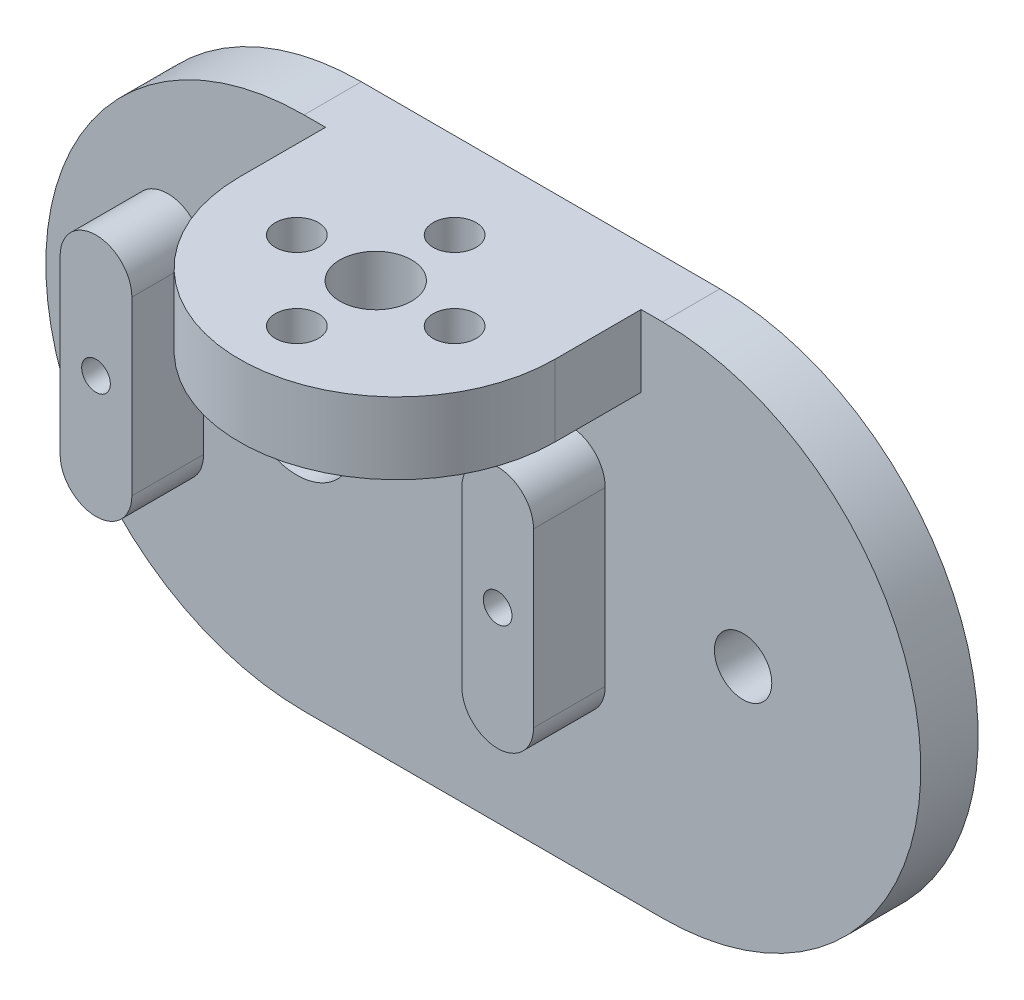
ISO-10303-21;
HEADER;
FILE_DESCRIPTION(('STEP AP214'),'2;1');
FILE_NAME('part.step','',(''),(''),'','','');
FILE_SCHEMA(('AUTOMOTIVE_DESIGN { 1 0 10303 214 1 1 1 1 }'));
ENDSEC;
DATA;
#1=APPLICATION_CONTEXT('core data for automotive mechanical design processes');
#2=APPLICATION_PROTOCOL_DEFINITION('international standard','automotive_design',2000,#1);
#3=PRODUCT_CONTEXT('',#1,'mechanical');
#4=PRODUCT('Part','Part','',(#3));
#5=PRODUCT_RELATED_PRODUCT_CATEGORY('part','',(#4));
#6=PRODUCT_DEFINITION_FORMATION('','',#4);
#7=PRODUCT_DEFINITION_CONTEXT('part definition',#1,'design');
#8=PRODUCT_DEFINITION('design','',#6,#7);
#9=PRODUCT_DEFINITION_SHAPE('','',#8);
#10=(LENGTH_UNIT() NAMED_UNIT(*) SI_UNIT(.MILLI.,.METRE.));
#11=(NAMED_UNIT(*) PLANE_ANGLE_UNIT() SI_UNIT($,.RADIAN.));
#12=(NAMED_UNIT(*) SI_UNIT($,.STERADIAN.) SOLID_ANGLE_UNIT());
#13=UNCERTAINTY_MEASURE_WITH_UNIT(LENGTH_MEASURE(1.E-05),#10,'distance_accuracy_value','');
#14=(GEOMETRIC_REPRESENTATION_CONTEXT(3) GLOBAL_UNCERTAINTY_ASSIGNED_CONTEXT((#13)) GLOBAL_UNIT_ASSIGNED_CONTEXT((#10,
#11,#12)) REPRESENTATION_CONTEXT('',''));
#15=CARTESIAN_POINT('',(0.,0.,0.));
#16=DIRECTION('',(0.,0.,1.));
#17=DIRECTION('',(1.,0.,0.));
#18=AXIS2_PLACEMENT_3D('',#15,#16,#17);
#19=CARTESIAN_POINT('',(0.,13.,10.));
#20=DIRECTION('',(0.,-1.,0.));
#21=DIRECTION('',(1.,0.,0.));
#22=AXIS2_PLACEMENT_3D('',#19,#20,#21);
#23=CYLINDRICAL_SURFACE('',#22,11.);
#24=DIRECTION('',(0.,-1.,0.));
#25=VECTOR('',#24,1.);
#26=CARTESIAN_POINT('',(-11.,18.,10.));
#27=LINE('',#26,#25);
#28=CARTESIAN_POINT('',(-11.,13.,10.));
#29=VERTEX_POINT('',#28);
#30=CARTESIAN_POINT('',(-11.,18.,10.));
#31=VERTEX_POINT('',#30);
#32=EDGE_CURVE('E217',#29,#31,#27,.F.);
#33=ORIENTED_EDGE('',*,*,#32,.F.);
#34=CARTESIAN_POINT('',(0.,13.,10.));
#35=DIRECTION('',(0.,1.,0.));
#36=DIRECTION('',(-1.,0.,0.));
#37=AXIS2_PLACEMENT_3D('',#34,#35,#36);
#38=CIRCLE('',#37,11.);
#39=CARTESIAN_POINT('',(11.,13.,10.));
#40=VERTEX_POINT('',#39);
#41=EDGE_CURVE('E52',#40,#29,#38,.F.);
#42=ORIENTED_EDGE('',*,*,#41,.F.);
#43=DIRECTION('',(0.,-1.,0.));
#44=VECTOR('',#43,1.);
#45=CARTESIAN_POINT('',(11.,18.,10.));
#46=LINE('',#45,#44);
#47=CARTESIAN_POINT('',(11.,18.,10.));
#48=VERTEX_POINT('',#47);
#49=EDGE_CURVE('E239',#48,#40,#46,.T.);
#50=ORIENTED_EDGE('',*,*,#49,.F.);
#51=CARTESIAN_POINT('',(0.,18.,10.));
#52=DIRECTION('',(0.,-1.,0.));
#53=DIRECTION('',(0.,0.,-1.));
#54=AXIS2_PLACEMENT_3D('',#51,#52,#53);
#55=CIRCLE('',#54,11.);
#56=EDGE_CURVE('E11',#31,#48,#55,.F.);
#57=ORIENTED_EDGE('',*,*,#56,.F.);
#58=EDGE_LOOP('',(#33,#42,#50,#57));
#59=FACE_BOUND('',#58,.T.);
#60=ADVANCED_FACE('F43',(#59),#23,.T.);
#61=CARTESIAN_POINT('',(-12.5,0.,4.));
#62=DIRECTION('',(0.,0.,1.));
#63=DIRECTION('',(1.,0.,0.));
#64=AXIS2_PLACEMENT_3D('',#61,#62,#63);
#65=PLANE('',#64);
#66=CARTESIAN_POINT('',(18.1101964169557,0.,4.));
#67=DIRECTION('',(0.,0.,1.));
#68=DIRECTION('',(1.,0.,0.));
#69=AXIS2_PLACEMENT_3D('',#66,#67,#68);
#70=CIRCLE('',#69,2.);
#71=CARTESIAN_POINT('',(20.1101964169557,0.,4.));
#72=VERTEX_POINT('',#71);
#73=EDGE_CURVE('E161',#72,#72,#70,.T.);
#74=ORIENTED_EDGE('',*,*,#73,.F.);
#75=EDGE_LOOP('',(#74));
#76=FACE_BOUND('',#75,.T.);
#77=CARTESIAN_POINT('',(-13.,0.,4.));
#78=DIRECTION('',(0.,0.,1.));
#79=DIRECTION('',(1.,0.,0.));
#80=AXIS2_PLACEMENT_3D('',#77,#78,#79);
#81=CIRCLE('',#80,4.);
#82=CARTESIAN_POINT('',(-9.,0.,4.));
#83=VERTEX_POINT('',#82);
#84=EDGE_CURVE('E223',#83,#83,#81,.T.);
#85=ORIENTED_EDGE('',*,*,#84,.F.);
#86=EDGE_LOOP('',(#85));
#87=FACE_BOUND('',#86,.T.);
#88=CARTESIAN_POINT('',(6.,-6.,4.));
#89=DIRECTION('',(0.,0.,1.));
#90=DIRECTION('',(1.,0.,0.));
#91=AXIS2_PLACEMENT_3D('',#88,#89,#90);
#92=CIRCLE('',#91,2.5);
#93=CARTESIAN_POINT('',(3.5,-6.,4.));
#94=VERTEX_POINT('',#93);
#95=CARTESIAN_POINT('',(8.5,-6.,4.));
#96=VERTEX_POINT('',#95);
#97=EDGE_CURVE('E288',#94,#96,#92,.T.);
#98=ORIENTED_EDGE('',*,*,#97,.F.);
#99=DIRECTION('',(0.,-1.,0.));
#100=VECTOR('',#99,1.);
#101=CARTESIAN_POINT('',(3.5,0.,4.));
#102=LINE('',#101,#100);
#103=CARTESIAN_POINT('',(3.5,6.,4.));
#104=VERTEX_POINT('',#103);
#105=EDGE_CURVE('E235',#104,#94,#102,.T.);
#106=ORIENTED_EDGE('',*,*,#105,.F.);
#107=CARTESIAN_POINT('',(6.,6.,4.));
#108=DIRECTION('',(0.,0.,1.));
#109=DIRECTION('',(1.,0.,0.));
#110=AXIS2_PLACEMENT_3D('',#107,#108,#109);
#111=CIRCLE('',#110,2.5);
#112=CARTESIAN_POINT('',(8.5,6.,4.));
#113=VERTEX_POINT('',#112);
#114=EDGE_CURVE('E270',#113,#104,#111,.T.);
#115=ORIENTED_EDGE('',*,*,#114,.F.);
#116=DIRECTION('',(0.,-1.,0.));
#117=VECTOR('',#116,1.);
#118=CARTESIAN_POINT('',(8.5,0.,4.));
#119=LINE('',#118,#117);
#120=EDGE_CURVE('E292',#113,#96,#119,.T.);
#121=ORIENTED_EDGE('',*,*,#120,.T.);
#122=EDGE_LOOP('',(#98,#106,#115,#121));
#123=FACE_BOUND('',#122,.T.);
#124=CARTESIAN_POINT('',(-22.,-6.,4.));
#125=DIRECTION('',(0.,0.,1.));
#126=DIRECTION('',(1.,0.,0.));
#127=AXIS2_PLACEMENT_3D('',#124,#125,#126);
#128=CIRCLE('',#127,2.5);
#129=CARTESIAN_POINT('',(-24.5,-6.00000000000002,4.));
#130=VERTEX_POINT('',#129);
#131=CARTESIAN_POINT('',(-19.5,-6.00000000000002,4.));
#132=VERTEX_POINT('',#131);
#133=EDGE_CURVE('E335',#130,#132,#128,.T.);
#134=ORIENTED_EDGE('',*,*,#133,.F.);
#135=DIRECTION('',(0.,-1.,0.));
#136=VECTOR('',#135,1.);
#137=CARTESIAN_POINT('',(-24.5,0.,4.));
#138=LINE('',#137,#136);
#139=CARTESIAN_POINT('',(-24.5,5.99999999999998,4.));
#140=VERTEX_POINT('',#139);
#141=EDGE_CURVE('E311',#140,#130,#138,.T.);
#142=ORIENTED_EDGE('',*,*,#141,.F.);
#143=CARTESIAN_POINT('',(-22.,5.99999999999998,4.));
#144=DIRECTION('',(0.,0.,1.));
#145=DIRECTION('',(1.,0.,0.));
#146=AXIS2_PLACEMENT_3D('',#143,#144,#145);
#147=CIRCLE('',#146,2.5);
#148=CARTESIAN_POINT('',(-19.5,5.99999999999998,4.));
#149=VERTEX_POINT('',#148);
#150=EDGE_CURVE('E317',#149,#140,#147,.T.);
#151=ORIENTED_EDGE('',*,*,#150,.F.);
#152=DIRECTION('',(0.,-1.,0.));
#153=VECTOR('',#152,1.);
#154=CARTESIAN_POINT('',(-19.5,0.,4.));
#155=LINE('',#154,#153);
#156=EDGE_CURVE('E339',#149,#132,#155,.T.);
#157=ORIENTED_EDGE('',*,*,#156,.T.);
#158=EDGE_LOOP('',(#134,#142,#151,#157));
#159=FACE_BOUND('',#158,.T.);
#160=DIRECTION('',(-1.,0.,0.));
#161=VECTOR('',#160,1.);
#162=CARTESIAN_POINT('',(-12.5,18.,4.));
#163=LINE('',#162,#161);
#164=CARTESIAN_POINT('',(12.5,18.,4.));
#165=VERTEX_POINT('',#164);
#166=CARTESIAN_POINT('',(11.,18.,4.));
#167=VERTEX_POINT('',#166);
#168=EDGE_CURVE('E158',#165,#167,#163,.T.);
#169=ORIENTED_EDGE('',*,*,#168,.T.);
#170=DIRECTION('',(0.,1.,0.));
#171=VECTOR('',#170,1.);
#172=CARTESIAN_POINT('',(11.,18.,4.));
#173=LINE('',#172,#171);
#174=CARTESIAN_POINT('',(11.,13.,4.));
#175=VERTEX_POINT('',#174);
#176=EDGE_CURVE('E165',#175,#167,#173,.T.);
#177=ORIENTED_EDGE('',*,*,#176,.F.);
#178=DIRECTION('',(1.,0.,0.));
#179=VECTOR('',#178,1.);
#180=CARTESIAN_POINT('',(11.,13.,4.));
#181=LINE('',#180,#179);
#182=CARTESIAN_POINT('',(-11.,13.,4.));
#183=VERTEX_POINT('',#182);
#184=EDGE_CURVE('E255',#183,#175,#181,.T.);
#185=ORIENTED_EDGE('',*,*,#184,.F.);
#186=DIRECTION('',(0.,-1.,0.));
#187=VECTOR('',#186,1.);
#188=CARTESIAN_POINT('',(-11.,18.,4.));
#189=LINE('',#188,#187);
#190=CARTESIAN_POINT('',(-11.,18.,4.));
#191=VERTEX_POINT('',#190);
#192=EDGE_CURVE('E173',#191,#183,#189,.T.);
#193=ORIENTED_EDGE('',*,*,#192,.F.);
#194=CARTESIAN_POINT('',(-12.5,18.,4.));
#195=VERTEX_POINT('',#194);
#196=EDGE_CURVE('E182',#191,#195,#163,.T.);
#197=ORIENTED_EDGE('',*,*,#196,.T.);
#198=CARTESIAN_POINT('',(-12.5,0.,4.));
#199=DIRECTION('',(0.,0.,1.));
#200=DIRECTION('',(1.,0.,0.));
#201=AXIS2_PLACEMENT_3D('',#198,#199,#200);
#202=CIRCLE('',#201,18.);
#203=CARTESIAN_POINT('',(-12.5,-18.,4.));
#204=VERTEX_POINT('',#203);
#205=EDGE_CURVE('E205',#195,#204,#202,.T.);
#206=ORIENTED_EDGE('',*,*,#205,.T.);
#207=DIRECTION('',(1.,0.,0.));
#208=VECTOR('',#207,1.);
#209=CARTESIAN_POINT('',(-12.5,-18.,4.));
#210=LINE('',#209,#208);
#211=CARTESIAN_POINT('',(12.5,-18.,4.));
#212=VERTEX_POINT('',#211);
#213=EDGE_CURVE('E359',#204,#212,#210,.T.);
#214=ORIENTED_EDGE('',*,*,#213,.T.);
#215=CARTESIAN_POINT('',(12.5,0.,4.));
#216=DIRECTION('',(0.,0.,1.));
#217=DIRECTION('',(1.,0.,0.));
#218=AXIS2_PLACEMENT_3D('',#215,#216,#217);
#219=CIRCLE('',#218,18.);
#220=EDGE_CURVE('E178',#212,#165,#219,.T.);
#221=ORIENTED_EDGE('',*,*,#220,.T.);
#222=EDGE_LOOP('',(#169,#177,#185,#193,#197,#206,#214,#221));
#223=FACE_BOUND('',#222,.T.);
#224=ADVANCED_FACE('F176',(#76,#87,#123,#159,#223),#65,.T.);
#225=CARTESIAN_POINT('',(-12.5,0.,4.));
#226=DIRECTION('',(0.,0.,-1.));
#227=DIRECTION('',(-1.,0.,0.));
#228=AXIS2_PLACEMENT_3D('',#225,#226,#227);
#229=CYLINDRICAL_SURFACE('',#228,18.);
#230=CARTESIAN_POINT('',(-12.5,0.,0.));
#231=DIRECTION('',(0.,0.,1.));
#232=DIRECTION('',(1.,0.,0.));
#233=AXIS2_PLACEMENT_3D('',#230,#231,#232);
#234=CIRCLE('',#233,18.);
#235=CARTESIAN_POINT('',(-12.5,18.,0.));
#236=VERTEX_POINT('',#235);
#237=CARTESIAN_POINT('',(-12.5,-18.,0.));
#238=VERTEX_POINT('',#237);
#239=EDGE_CURVE('E192',#236,#238,#234,.T.);
#240=ORIENTED_EDGE('',*,*,#239,.T.);
#241=DIRECTION('',(0.,0.,-1.));
#242=VECTOR('',#241,1.);
#243=CARTESIAN_POINT('',(-12.5,-18.,4.));
#244=LINE('',#243,#242);
#245=EDGE_CURVE('E213',#204,#238,#244,.T.);
#246=ORIENTED_EDGE('',*,*,#245,.F.);
#247=ORIENTED_EDGE('',*,*,#205,.F.);
#248=DIRECTION('',(0.,0.,-1.));
#249=VECTOR('',#248,1.);
#250=CARTESIAN_POINT('',(-12.5,18.,4.));
#251=LINE('',#250,#249);
#252=EDGE_CURVE('E181',#195,#236,#251,.T.);
#253=ORIENTED_EDGE('',*,*,#252,.T.);
#254=EDGE_LOOP('',(#240,#246,#247,#253));
#255=FACE_BOUND('',#254,.T.);
#256=ADVANCED_FACE('F376',(#255),#229,.T.);
#257=CARTESIAN_POINT('',(-12.5,-18.,4.));
#258=DIRECTION('',(0.,1.,0.));
#259=DIRECTION('',(-1.,0.,0.));
#260=AXIS2_PLACEMENT_3D('',#257,#258,#259);
#261=PLANE('',#260);
#262=DIRECTION('',(1.,0.,0.));
#263=VECTOR('',#262,1.);
#264=CARTESIAN_POINT('',(-12.5,-18.,0.));
#265=LINE('',#264,#263);
#266=CARTESIAN_POINT('',(12.5,-18.,0.));
#267=VERTEX_POINT('',#266);
#268=EDGE_CURVE('E196',#238,#267,#265,.T.);
#269=ORIENTED_EDGE('',*,*,#268,.T.);
#270=DIRECTION('',(0.,0.,-1.));
#271=VECTOR('',#270,1.);
#272=CARTESIAN_POINT('',(12.5,-18.,4.));
#273=LINE('',#272,#271);
#274=EDGE_CURVE('E209',#212,#267,#273,.T.);
#275=ORIENTED_EDGE('',*,*,#274,.F.);
#276=ORIENTED_EDGE('',*,*,#213,.F.);
#277=ORIENTED_EDGE('',*,*,#245,.T.);
#278=EDGE_LOOP('',(#269,#275,#276,#277));
#279=FACE_BOUND('',#278,.T.);
#280=ADVANCED_FACE('F366',(#279),#261,.F.);
#281=CARTESIAN_POINT('',(12.5,0.,4.));
#282=DIRECTION('',(0.,0.,-1.));
#283=DIRECTION('',(-1.,0.,0.));
#284=AXIS2_PLACEMENT_3D('',#281,#282,#283);
#285=CYLINDRICAL_SURFACE('',#284,18.);
#286=CARTESIAN_POINT('',(12.5,0.,0.));
#287=DIRECTION('',(0.,0.,1.));
#288=DIRECTION('',(1.,0.,0.));
#289=AXIS2_PLACEMENT_3D('',#286,#287,#288);
#290=CIRCLE('',#289,18.);
#291=CARTESIAN_POINT('',(12.5,18.,0.));
#292=VERTEX_POINT('',#291);
#293=EDGE_CURVE('E200',#267,#292,#290,.T.);
#294=ORIENTED_EDGE('',*,*,#293,.T.);
#295=DIRECTION('',(0.,0.,-1.));
#296=VECTOR('',#295,1.);
#297=CARTESIAN_POINT('',(12.5,18.,4.));
#298=LINE('',#297,#296);
#299=EDGE_CURVE('E187',#165,#292,#298,.T.);
#300=ORIENTED_EDGE('',*,*,#299,.F.);
#301=ORIENTED_EDGE('',*,*,#220,.F.);
#302=ORIENTED_EDGE('',*,*,#274,.T.);
#303=EDGE_LOOP('',(#294,#300,#301,#302));
#304=FACE_BOUND('',#303,.T.);
#305=ADVANCED_FACE('F369',(#304),#285,.T.);
#306=CARTESIAN_POINT('',(-12.5,18.,4.));
#307=DIRECTION('',(0.,-1.,0.));
#308=DIRECTION('',(0.,0.,-1.));
#309=AXIS2_PLACEMENT_3D('',#306,#307,#308);
#310=PLANE('',#309);
#311=CARTESIAN_POINT('',(5.5,18.,11.5));
#312=DIRECTION('',(0.,-1.,0.));
#313=DIRECTION('',(0.,0.,-1.));
#314=AXIS2_PLACEMENT_3D('',#311,#312,#313);
#315=CIRCLE('',#314,1.5);
#316=CARTESIAN_POINT('',(5.5,18.,10.));
#317=VERTEX_POINT('',#316);
#318=EDGE_CURVE('E174',#317,#317,#315,.T.);
#319=ORIENTED_EDGE('',*,*,#318,.T.);
#320=EDGE_LOOP('',(#319));
#321=FACE_BOUND('',#320,.T.);
#322=CARTESIAN_POINT('',(0.,18.,6.));
#323=DIRECTION('',(0.,-1.,0.));
#324=DIRECTION('',(0.,0.,-1.));
#325=AXIS2_PLACEMENT_3D('',#322,#323,#324);
#326=CIRCLE('',#325,1.5);
#327=CARTESIAN_POINT('',(0.,18.,4.5));
#328=VERTEX_POINT('',#327);
#329=EDGE_CURVE('E385',#328,#328,#326,.T.);
#330=ORIENTED_EDGE('',*,*,#329,.T.);
#331=EDGE_LOOP('',(#330));
#332=FACE_BOUND('',#331,.T.);
#333=CARTESIAN_POINT('',(-5.5,18.,11.5));
#334=DIRECTION('',(0.,-1.,0.));
#335=DIRECTION('',(0.,0.,-1.));
#336=AXIS2_PLACEMENT_3D('',#333,#334,#335);
#337=CIRCLE('',#336,1.5);
#338=CARTESIAN_POINT('',(-5.5,18.,10.));
#339=VERTEX_POINT('',#338);
#340=EDGE_CURVE('E389',#339,#339,#337,.T.);
#341=ORIENTED_EDGE('',*,*,#340,.T.);
#342=EDGE_LOOP('',(#341));
#343=FACE_BOUND('',#342,.T.);
#344=CARTESIAN_POINT('',(0.,18.,11.5));
#345=DIRECTION('',(0.,-1.,0.));
#346=DIRECTION('',(0.,0.,-1.));
#347=AXIS2_PLACEMENT_3D('',#344,#345,#346);
#348=CIRCLE('',#347,2.5);
#349=CARTESIAN_POINT('',(0.,18.,9.));
#350=VERTEX_POINT('',#349);
#351=EDGE_CURVE('E393',#350,#350,#348,.T.);
#352=ORIENTED_EDGE('',*,*,#351,.T.);
#353=EDGE_LOOP('',(#352));
#354=FACE_BOUND('',#353,.T.);
#355=CARTESIAN_POINT('',(0.,18.,17.));
#356=DIRECTION('',(0.,-1.,0.));
#357=DIRECTION('',(0.,0.,-1.));
#358=AXIS2_PLACEMENT_3D('',#355,#356,#357);
#359=CIRCLE('',#358,1.5);
#360=CARTESIAN_POINT('',(0.,18.,15.5));
#361=VERTEX_POINT('',#360);
#362=EDGE_CURVE('E397',#361,#361,#359,.T.);
#363=ORIENTED_EDGE('',*,*,#362,.T.);
#364=EDGE_LOOP('',(#363));
#365=FACE_BOUND('',#364,.T.);
#366=DIRECTION('',(0.,0.,-1.));
#367=VECTOR('',#366,1.);
#368=CARTESIAN_POINT('',(-11.,18.,21.));
#369=LINE('',#368,#367);
#370=EDGE_CURVE('E162',#31,#191,#369,.T.);
#371=ORIENTED_EDGE('',*,*,#370,.F.);
#372=ORIENTED_EDGE('',*,*,#56,.T.);
#373=DIRECTION('',(0.,0.,-1.));
#374=VECTOR('',#373,1.);
#375=CARTESIAN_POINT('',(11.,18.,21.));
#376=LINE('',#375,#374);
#377=EDGE_CURVE('E153',#48,#167,#376,.T.);
#378=ORIENTED_EDGE('',*,*,#377,.T.);
#379=ORIENTED_EDGE('',*,*,#168,.F.);
#380=ORIENTED_EDGE('',*,*,#299,.T.);
#381=DIRECTION('',(-1.,0.,0.));
#382=VECTOR('',#381,1.);
#383=CARTESIAN_POINT('',(-12.5,18.,0.));
#384=LINE('',#383,#382);
#385=EDGE_CURVE('E203',#292,#236,#384,.T.);
#386=ORIENTED_EDGE('',*,*,#385,.T.);
#387=ORIENTED_EDGE('',*,*,#252,.F.);
#388=ORIENTED_EDGE('',*,*,#196,.F.);
#389=EDGE_LOOP('',(#371,#372,#378,#379,#380,#386,#387,#388));
#390=FACE_BOUND('',#389,.T.);
#391=ADVANCED_FACE('F155',(#321,#332,#343,#354,#365,#390),#310,.F.);
#392=CARTESIAN_POINT('',(-12.5,0.,0.));
#393=DIRECTION('',(0.,0.,1.));
#394=DIRECTION('',(1.,0.,0.));
#395=AXIS2_PLACEMENT_3D('',#392,#393,#394);
#396=PLANE('',#395);
#397=CARTESIAN_POINT('',(18.1101964169557,0.,0.));
#398=DIRECTION('',(0.,0.,1.));
#399=DIRECTION('',(1.,0.,0.));
#400=AXIS2_PLACEMENT_3D('',#397,#398,#399);
#401=CIRCLE('',#400,2.);
#402=CARTESIAN_POINT('',(20.1101964169557,0.,0.));
#403=VERTEX_POINT('',#402);
#404=EDGE_CURVE('E231',#403,#403,#401,.T.);
#405=ORIENTED_EDGE('',*,*,#404,.T.);
#406=EDGE_LOOP('',(#405));
#407=FACE_BOUND('',#406,.T.);
#408=CARTESIAN_POINT('',(-22.,0.,0.));
#409=DIRECTION('',(0.,0.,1.));
#410=DIRECTION('',(1.,0.,0.));
#411=AXIS2_PLACEMENT_3D('',#408,#409,#410);
#412=CIRCLE('',#411,1.);
#413=CARTESIAN_POINT('',(-21.,0.,0.));
#414=VERTEX_POINT('',#413);
#415=EDGE_CURVE('E227',#414,#414,#412,.T.);
#416=ORIENTED_EDGE('',*,*,#415,.T.);
#417=EDGE_LOOP('',(#416));
#418=FACE_BOUND('',#417,.T.);
#419=CARTESIAN_POINT('',(6.,0.,0.));
#420=DIRECTION('',(0.,0.,1.));
#421=DIRECTION('',(1.,0.,0.));
#422=AXIS2_PLACEMENT_3D('',#419,#420,#421);
#423=CIRCLE('',#422,1.);
#424=CARTESIAN_POINT('',(7.,0.,0.));
#425=VERTEX_POINT('',#424);
#426=EDGE_CURVE('E222',#425,#425,#423,.T.);
#427=ORIENTED_EDGE('',*,*,#426,.T.);
#428=EDGE_LOOP('',(#427));
#429=FACE_BOUND('',#428,.T.);
#430=CARTESIAN_POINT('',(-13.,0.,0.));
#431=DIRECTION('',(0.,0.,1.));
#432=DIRECTION('',(1.,0.,0.));
#433=AXIS2_PLACEMENT_3D('',#430,#431,#432);
#434=CIRCLE('',#433,4.);
#435=CARTESIAN_POINT('',(-9.,0.,0.));
#436=VERTEX_POINT('',#435);
#437=EDGE_CURVE('E218',#436,#436,#434,.T.);
#438=ORIENTED_EDGE('',*,*,#437,.T.);
#439=EDGE_LOOP('',(#438));
#440=FACE_BOUND('',#439,.T.);
#441=ORIENTED_EDGE('',*,*,#239,.F.);
#442=ORIENTED_EDGE('',*,*,#385,.F.);
#443=ORIENTED_EDGE('',*,*,#293,.F.);
#444=ORIENTED_EDGE('',*,*,#268,.F.);
#445=EDGE_LOOP('',(#441,#442,#443,#444));
#446=FACE_BOUND('',#445,.T.);
#447=ADVANCED_FACE('F374',(#407,#418,#429,#440,#446),#396,.F.);
#448=CARTESIAN_POINT('',(-24.5,0.,9.));
#449=DIRECTION('',(1.,0.,0.));
#450=DIRECTION('',(0.,1.,0.));
#451=AXIS2_PLACEMENT_3D('',#448,#449,#450);
#452=PLANE('',#451);
#453=ORIENTED_EDGE('',*,*,#141,.T.);
#454=DIRECTION('',(0.,0.,-1.));
#455=VECTOR('',#454,1.);
#456=CARTESIAN_POINT('',(-24.5,-6.00000000000002,9.));
#457=LINE('',#456,#455);
#458=CARTESIAN_POINT('',(-24.5,-6.00000000000002,9.));
#459=VERTEX_POINT('',#458);
#460=EDGE_CURVE('E197',#459,#130,#457,.T.);
#461=ORIENTED_EDGE('',*,*,#460,.F.);
#462=DIRECTION('',(0.,-1.,0.));
#463=VECTOR('',#462,1.);
#464=CARTESIAN_POINT('',(-24.5,0.,9.));
#465=LINE('',#464,#463);
#466=CARTESIAN_POINT('',(-24.5,5.99999999999998,9.));
#467=VERTEX_POINT('',#466);
#468=EDGE_CURVE('E316',#467,#459,#465,.T.);
#469=ORIENTED_EDGE('',*,*,#468,.F.);
#470=DIRECTION('',(0.,0.,-1.));
#471=VECTOR('',#470,1.);
#472=CARTESIAN_POINT('',(-24.5,5.99999999999998,9.));
#473=LINE('',#472,#471);
#474=EDGE_CURVE('E331',#467,#140,#473,.T.);
#475=ORIENTED_EDGE('',*,*,#474,.T.);
#476=EDGE_LOOP('',(#453,#461,#469,#475));
#477=FACE_BOUND('',#476,.T.);
#478=ADVANCED_FACE('F450',(#477),#452,.F.);
#479=CARTESIAN_POINT('',(-22.,-6.,9.));
#480=DIRECTION('',(0.,0.,-1.));
#481=DIRECTION('',(-1.,0.,0.));
#482=AXIS2_PLACEMENT_3D('',#479,#480,#481);
#483=CYLINDRICAL_SURFACE('',#482,2.5);
#484=ORIENTED_EDGE('',*,*,#133,.T.);
#485=DIRECTION('',(0.,0.,-1.));
#486=VECTOR('',#485,1.);
#487=CARTESIAN_POINT('',(-19.5,-6.00000000000002,9.));
#488=LINE('',#487,#486);
#489=CARTESIAN_POINT('',(-19.5,-6.00000000000002,9.));
#490=VERTEX_POINT('',#489);
#491=EDGE_CURVE('E352',#490,#132,#488,.T.);
#492=ORIENTED_EDGE('',*,*,#491,.F.);
#493=CARTESIAN_POINT('',(-22.,-6.,9.));
#494=DIRECTION('',(0.,0.,1.));
#495=DIRECTION('',(1.,0.,0.));
#496=AXIS2_PLACEMENT_3D('',#493,#494,#495);
#497=CIRCLE('',#496,2.5);
#498=EDGE_CURVE('E321',#459,#490,#497,.T.);
#499=ORIENTED_EDGE('',*,*,#498,.F.);
#500=ORIENTED_EDGE('',*,*,#460,.T.);
#501=EDGE_LOOP('',(#484,#492,#499,#500));
#502=FACE_BOUND('',#501,.T.);
#503=ADVANCED_FACE('F475',(#502),#483,.T.);
#504=CARTESIAN_POINT('',(-19.5,0.,9.));
#505=DIRECTION('',(1.,0.,0.));
#506=DIRECTION('',(0.,0.,-1.));
#507=AXIS2_PLACEMENT_3D('',#504,#505,#506);
#508=PLANE('',#507);
#509=ORIENTED_EDGE('',*,*,#156,.F.);
#510=DIRECTION('',(0.,0.,-1.));
#511=VECTOR('',#510,1.);
#512=CARTESIAN_POINT('',(-19.5,5.99999999999999,9.));
#513=LINE('',#512,#511);
#514=CARTESIAN_POINT('',(-19.5,5.99999999999999,9.));
#515=VERTEX_POINT('',#514);
#516=EDGE_CURVE('E348',#515,#149,#513,.T.);
#517=ORIENTED_EDGE('',*,*,#516,.F.);
#518=DIRECTION('',(0.,-1.,0.));
#519=VECTOR('',#518,1.);
#520=CARTESIAN_POINT('',(-19.5,0.,9.));
#521=LINE('',#520,#519);
#522=EDGE_CURVE('E324',#515,#490,#521,.T.);
#523=ORIENTED_EDGE('',*,*,#522,.T.);
#524=ORIENTED_EDGE('',*,*,#491,.T.);
#525=EDGE_LOOP('',(#509,#517,#523,#524));
#526=FACE_BOUND('',#525,.T.);
#527=ADVANCED_FACE('F471',(#526),#508,.T.);
#528=CARTESIAN_POINT('',(-22.,0.,9.));
#529=DIRECTION('',(0.,0.,-1.));
#530=DIRECTION('',(-1.,0.,0.));
#531=AXIS2_PLACEMENT_3D('',#528,#529,#530);
#532=CYLINDRICAL_SURFACE('',#531,1.);
#533=CARTESIAN_POINT('',(-22.,0.,9.));
#534=DIRECTION('',(0.,0.,1.));
#535=DIRECTION('',(1.,0.,0.));
#536=AXIS2_PLACEMENT_3D('',#533,#534,#535);
#537=CIRCLE('',#536,1.);
#538=CARTESIAN_POINT('',(-21.,0.,9.));
#539=VERTEX_POINT('',#538);
#540=EDGE_CURVE('E312',#539,#539,#537,.T.);
#541=ORIENTED_EDGE('',*,*,#540,.T.);
#542=EDGE_LOOP('',(#541));
#543=FACE_BOUND('',#542,.T.);
#544=ORIENTED_EDGE('',*,*,#415,.F.);
#545=EDGE_LOOP('',(#544));
#546=FACE_BOUND('',#545,.T.);
#547=ADVANCED_FACE('F467',(#543,#546),#532,.F.);
#548=CARTESIAN_POINT('',(-22.,5.99999999999998,9.));
#549=DIRECTION('',(0.,0.,-1.));
#550=DIRECTION('',(-1.,0.,0.));
#551=AXIS2_PLACEMENT_3D('',#548,#549,#550);
#552=CYLINDRICAL_SURFACE('',#551,2.5);
#553=ORIENTED_EDGE('',*,*,#150,.T.);
#554=ORIENTED_EDGE('',*,*,#474,.F.);
#555=CARTESIAN_POINT('',(-22.,5.99999999999998,9.));
#556=DIRECTION('',(0.,0.,1.));
#557=DIRECTION('',(1.,0.,0.));
#558=AXIS2_PLACEMENT_3D('',#555,#556,#557);
#559=CIRCLE('',#558,2.5);
#560=EDGE_CURVE('E328',#515,#467,#559,.T.);
#561=ORIENTED_EDGE('',*,*,#560,.F.);
#562=ORIENTED_EDGE('',*,*,#516,.T.);
#563=EDGE_LOOP('',(#553,#554,#561,#562));
#564=FACE_BOUND('',#563,.T.);
#565=ADVANCED_FACE('F470',(#564),#552,.T.);
#566=CARTESIAN_POINT('',(0.,0.,9.));
#567=DIRECTION('',(0.,0.,1.));
#568=DIRECTION('',(1.,0.,0.));
#569=AXIS2_PLACEMENT_3D('',#566,#567,#568);
#570=PLANE('',#569);
#571=ORIENTED_EDGE('',*,*,#540,.F.);
#572=EDGE_LOOP('',(#571));
#573=FACE_BOUND('',#572,.T.);
#574=ORIENTED_EDGE('',*,*,#468,.T.);
#575=ORIENTED_EDGE('',*,*,#498,.T.);
#576=ORIENTED_EDGE('',*,*,#522,.F.);
#577=ORIENTED_EDGE('',*,*,#560,.T.);
#578=EDGE_LOOP('',(#574,#575,#576,#577));
#579=FACE_BOUND('',#578,.T.);
#580=ADVANCED_FACE('F485',(#573,#579),#570,.T.);
#581=CARTESIAN_POINT('',(3.5,0.,9.));
#582=DIRECTION('',(1.,0.,0.));
#583=DIRECTION('',(0.,0.,-1.));
#584=AXIS2_PLACEMENT_3D('',#581,#582,#583);
#585=PLANE('',#584);
#586=ORIENTED_EDGE('',*,*,#105,.T.);
#587=DIRECTION('',(0.,0.,-1.));
#588=VECTOR('',#587,1.);
#589=CARTESIAN_POINT('',(3.5,-6.,9.));
#590=LINE('',#589,#588);
#591=CARTESIAN_POINT('',(3.5,-6.,9.));
#592=VERTEX_POINT('',#591);
#593=EDGE_CURVE('E308',#592,#94,#590,.T.);
#594=ORIENTED_EDGE('',*,*,#593,.F.);
#595=DIRECTION('',(0.,-1.,0.));
#596=VECTOR('',#595,1.);
#597=CARTESIAN_POINT('',(3.5,0.,9.));
#598=LINE('',#597,#596);
#599=CARTESIAN_POINT('',(3.5,6.,9.));
#600=VERTEX_POINT('',#599);
#601=EDGE_CURVE('E269',#600,#592,#598,.T.);
#602=ORIENTED_EDGE('',*,*,#601,.F.);
#603=DIRECTION('',(0.,0.,-1.));
#604=VECTOR('',#603,1.);
#605=CARTESIAN_POINT('',(3.5,6.,9.));
#606=LINE('',#605,#604);
#607=EDGE_CURVE('E284',#600,#104,#606,.T.);
#608=ORIENTED_EDGE('',*,*,#607,.T.);
#609=EDGE_LOOP('',(#586,#594,#602,#608));
#610=FACE_BOUND('',#609,.T.);
#611=ADVANCED_FACE('F489',(#610),#585,.F.);
#612=CARTESIAN_POINT('',(6.,-6.,9.));
#613=DIRECTION('',(0.,0.,-1.));
#614=DIRECTION('',(-1.,0.,0.));
#615=AXIS2_PLACEMENT_3D('',#612,#613,#614);
#616=CYLINDRICAL_SURFACE('',#615,2.5);
#617=ORIENTED_EDGE('',*,*,#97,.T.);
#618=DIRECTION('',(0.,0.,-1.));
#619=VECTOR('',#618,1.);
#620=CARTESIAN_POINT('',(8.5,-6.,9.));
#621=LINE('',#620,#619);
#622=CARTESIAN_POINT('',(8.5,-6.,9.));
#623=VERTEX_POINT('',#622);
#624=EDGE_CURVE('E305',#623,#96,#621,.T.);
#625=ORIENTED_EDGE('',*,*,#624,.F.);
#626=CARTESIAN_POINT('',(6.,-6.,9.));
#627=DIRECTION('',(0.,0.,1.));
#628=DIRECTION('',(1.,0.,0.));
#629=AXIS2_PLACEMENT_3D('',#626,#627,#628);
#630=CIRCLE('',#629,2.5);
#631=EDGE_CURVE('E274',#592,#623,#630,.T.);
#632=ORIENTED_EDGE('',*,*,#631,.F.);
#633=ORIENTED_EDGE('',*,*,#593,.T.);
#634=EDGE_LOOP('',(#617,#625,#632,#633));
#635=FACE_BOUND('',#634,.T.);
#636=ADVANCED_FACE('F499',(#635),#616,.T.);
#637=CARTESIAN_POINT('',(8.5,0.,9.));
#638=DIRECTION('',(1.,0.,0.));
#639=DIRECTION('',(0.,1.,0.));
#640=AXIS2_PLACEMENT_3D('',#637,#638,#639);
#641=PLANE('',#640);
#642=ORIENTED_EDGE('',*,*,#120,.F.);
#643=DIRECTION('',(0.,0.,-1.));
#644=VECTOR('',#643,1.);
#645=CARTESIAN_POINT('',(8.5,6.,9.));
#646=LINE('',#645,#644);
#647=CARTESIAN_POINT('',(8.5,6.,9.));
#648=VERTEX_POINT('',#647);
#649=EDGE_CURVE('E301',#648,#113,#646,.T.);
#650=ORIENTED_EDGE('',*,*,#649,.F.);
#651=DIRECTION('',(0.,-1.,0.));
#652=VECTOR('',#651,1.);
#653=CARTESIAN_POINT('',(8.5,0.,9.));
#654=LINE('',#653,#652);
#655=EDGE_CURVE('E277',#648,#623,#654,.T.);
#656=ORIENTED_EDGE('',*,*,#655,.T.);
#657=ORIENTED_EDGE('',*,*,#624,.T.);
#658=EDGE_LOOP('',(#642,#650,#656,#657));
#659=FACE_BOUND('',#658,.T.);
#660=ADVANCED_FACE('F495',(#659),#641,.T.);
#661=CARTESIAN_POINT('',(6.,0.,9.));
#662=DIRECTION('',(0.,0.,-1.));
#663=DIRECTION('',(-1.,0.,0.));
#664=AXIS2_PLACEMENT_3D('',#661,#662,#663);
#665=CYLINDRICAL_SURFACE('',#664,1.);
#666=CARTESIAN_POINT('',(6.,0.,9.));
#667=DIRECTION('',(0.,0.,1.));
#668=DIRECTION('',(1.,0.,0.));
#669=AXIS2_PLACEMENT_3D('',#666,#667,#668);
#670=CIRCLE('',#669,1.);
#671=CARTESIAN_POINT('',(7.,0.,9.));
#672=VERTEX_POINT('',#671);
#673=EDGE_CURVE('E265',#672,#672,#670,.T.);
#674=ORIENTED_EDGE('',*,*,#673,.T.);
#675=EDGE_LOOP('',(#674));
#676=FACE_BOUND('',#675,.T.);
#677=ORIENTED_EDGE('',*,*,#426,.F.);
#678=EDGE_LOOP('',(#677));
#679=FACE_BOUND('',#678,.T.);
#680=ADVANCED_FACE('F491',(#676,#679),#665,.F.);
#681=CARTESIAN_POINT('',(6.,6.,9.));
#682=DIRECTION('',(0.,0.,-1.));
#683=DIRECTION('',(-1.,0.,0.));
#684=AXIS2_PLACEMENT_3D('',#681,#682,#683);
#685=CYLINDRICAL_SURFACE('',#684,2.5);
#686=ORIENTED_EDGE('',*,*,#114,.T.);
#687=ORIENTED_EDGE('',*,*,#607,.F.);
#688=CARTESIAN_POINT('',(6.,6.,9.));
#689=DIRECTION('',(0.,0.,1.));
#690=DIRECTION('',(1.,0.,0.));
#691=AXIS2_PLACEMENT_3D('',#688,#689,#690);
#692=CIRCLE('',#691,2.5);
#693=EDGE_CURVE('E281',#648,#600,#692,.T.);
#694=ORIENTED_EDGE('',*,*,#693,.F.);
#695=ORIENTED_EDGE('',*,*,#649,.T.);
#696=EDGE_LOOP('',(#686,#687,#694,#695));
#697=FACE_BOUND('',#696,.T.);
#698=ADVANCED_FACE('F494',(#697),#685,.T.);
#699=CARTESIAN_POINT('',(0.,0.,9.));
#700=DIRECTION('',(0.,0.,1.));
#701=DIRECTION('',(1.,0.,0.));
#702=AXIS2_PLACEMENT_3D('',#699,#700,#701);
#703=PLANE('',#702);
#704=ORIENTED_EDGE('',*,*,#673,.F.);
#705=EDGE_LOOP('',(#704));
#706=FACE_BOUND('',#705,.T.);
#707=ORIENTED_EDGE('',*,*,#601,.T.);
#708=ORIENTED_EDGE('',*,*,#631,.T.);
#709=ORIENTED_EDGE('',*,*,#655,.F.);
#710=ORIENTED_EDGE('',*,*,#693,.T.);
#711=EDGE_LOOP('',(#707,#708,#709,#710));
#712=FACE_BOUND('',#711,.T.);
#713=ADVANCED_FACE('F509',(#706,#712),#703,.T.);
#714=CARTESIAN_POINT('',(-13.,0.,-1.));
#715=DIRECTION('',(0.,0.,1.));
#716=DIRECTION('',(1.,0.,0.));
#717=AXIS2_PLACEMENT_3D('',#714,#715,#716);
#718=CYLINDRICAL_SURFACE('',#717,4.);
#719=ORIENTED_EDGE('',*,*,#84,.T.);
#720=EDGE_LOOP('',(#719));
#721=FACE_BOUND('',#720,.T.);
#722=ORIENTED_EDGE('',*,*,#437,.F.);
#723=EDGE_LOOP('',(#722));
#724=FACE_BOUND('',#723,.T.);
#725=ADVANCED_FACE('F513',(#721,#724),#718,.F.);
#726=CARTESIAN_POINT('',(18.1101964169557,0.,-1.));
#727=DIRECTION('',(0.,0.,1.));
#728=DIRECTION('',(1.,0.,0.));
#729=AXIS2_PLACEMENT_3D('',#726,#727,#728);
#730=CYLINDRICAL_SURFACE('',#729,2.);
#731=ORIENTED_EDGE('',*,*,#73,.T.);
#732=EDGE_LOOP('',(#731));
#733=FACE_BOUND('',#732,.T.);
#734=ORIENTED_EDGE('',*,*,#404,.F.);
#735=EDGE_LOOP('',(#734));
#736=FACE_BOUND('',#735,.T.);
#737=ADVANCED_FACE('F517',(#733,#736),#730,.F.);
#738=CARTESIAN_POINT('',(11.,18.,21.));
#739=DIRECTION('',(-1.,0.,0.));
#740=DIRECTION('',(0.,-1.,0.));
#741=AXIS2_PLACEMENT_3D('',#738,#739,#740);
#742=PLANE('',#741);
#743=ORIENTED_EDGE('',*,*,#377,.F.);
#744=ORIENTED_EDGE('',*,*,#49,.T.);
#745=DIRECTION('',(0.,0.,-1.));
#746=VECTOR('',#745,1.);
#747=CARTESIAN_POINT('',(11.,13.,21.));
#748=LINE('',#747,#746);
#749=EDGE_CURVE('E168',#40,#175,#748,.T.);
#750=ORIENTED_EDGE('',*,*,#749,.T.);
#751=ORIENTED_EDGE('',*,*,#176,.T.);
#752=EDGE_LOOP('',(#743,#744,#750,#751));
#753=FACE_BOUND('',#752,.T.);
#754=ADVANCED_FACE('F166',(#753),#742,.F.);
#755=CARTESIAN_POINT('',(-11.,18.,21.));
#756=DIRECTION('',(1.,0.,0.));
#757=DIRECTION('',(0.,1.,0.));
#758=AXIS2_PLACEMENT_3D('',#755,#756,#757);
#759=PLANE('',#758);
#760=DIRECTION('',(0.,0.,-1.));
#761=VECTOR('',#760,1.);
#762=CARTESIAN_POINT('',(-11.,13.,21.));
#763=LINE('',#762,#761);
#764=EDGE_CURVE('E245',#29,#183,#763,.T.);
#765=ORIENTED_EDGE('',*,*,#764,.F.);
#766=ORIENTED_EDGE('',*,*,#32,.T.);
#767=ORIENTED_EDGE('',*,*,#370,.T.);
#768=ORIENTED_EDGE('',*,*,#192,.T.);
#769=EDGE_LOOP('',(#765,#766,#767,#768));
#770=FACE_BOUND('',#769,.T.);
#771=ADVANCED_FACE('F248',(#770),#759,.F.);
#772=CARTESIAN_POINT('',(11.,13.,21.));
#773=DIRECTION('',(0.,1.,0.));
#774=DIRECTION('',(-1.,0.,0.));
#775=AXIS2_PLACEMENT_3D('',#772,#773,#774);
#776=PLANE('',#775);
#777=CARTESIAN_POINT('',(5.5,13.,11.5));
#778=DIRECTION('',(0.,-1.,0.));
#779=DIRECTION('',(1.,0.,0.));
#780=AXIS2_PLACEMENT_3D('',#777,#778,#779);
#781=CIRCLE('',#780,1.5);
#782=CARTESIAN_POINT('',(7.,13.,11.5));
#783=VERTEX_POINT('',#782);
#784=EDGE_CURVE('E401',#783,#783,#781,.T.);
#785=ORIENTED_EDGE('',*,*,#784,.F.);
#786=EDGE_LOOP('',(#785));
#787=FACE_BOUND('',#786,.T.);
#788=CARTESIAN_POINT('',(0.,13.,6.));
#789=DIRECTION('',(0.,-1.,0.));
#790=DIRECTION('',(1.,0.,0.));
#791=AXIS2_PLACEMENT_3D('',#788,#789,#790);
#792=CIRCLE('',#791,1.5);
#793=CARTESIAN_POINT('',(1.5,13.,6.));
#794=VERTEX_POINT('',#793);
#795=EDGE_CURVE('E411',#794,#794,#792,.T.);
#796=ORIENTED_EDGE('',*,*,#795,.F.);
#797=EDGE_LOOP('',(#796));
#798=FACE_BOUND('',#797,.T.);
#799=CARTESIAN_POINT('',(-5.5,13.,11.5));
#800=DIRECTION('',(0.,-1.,0.));
#801=DIRECTION('',(1.,0.,0.));
#802=AXIS2_PLACEMENT_3D('',#799,#800,#801);
#803=CIRCLE('',#802,1.5);
#804=CARTESIAN_POINT('',(-4.,13.,11.5));
#805=VERTEX_POINT('',#804);
#806=EDGE_CURVE('E407',#805,#805,#803,.T.);
#807=ORIENTED_EDGE('',*,*,#806,.F.);
#808=EDGE_LOOP('',(#807));
#809=FACE_BOUND('',#808,.T.);
#810=CARTESIAN_POINT('',(0.,13.,11.5));
#811=DIRECTION('',(0.,-1.,0.));
#812=DIRECTION('',(1.,0.,0.));
#813=AXIS2_PLACEMENT_3D('',#810,#811,#812);
#814=CIRCLE('',#813,2.5);
#815=CARTESIAN_POINT('',(2.5,13.,11.5));
#816=VERTEX_POINT('',#815);
#817=EDGE_CURVE('E402',#816,#816,#814,.T.);
#818=ORIENTED_EDGE('',*,*,#817,.F.);
#819=EDGE_LOOP('',(#818));
#820=FACE_BOUND('',#819,.T.);
#821=CARTESIAN_POINT('',(0.,13.,17.));
#822=DIRECTION('',(0.,-1.,0.));
#823=DIRECTION('',(1.,0.,0.));
#824=AXIS2_PLACEMENT_3D('',#821,#822,#823);
#825=CIRCLE('',#824,1.5);
#826=CARTESIAN_POINT('',(1.5,13.,17.));
#827=VERTEX_POINT('',#826);
#828=EDGE_CURVE('E406',#827,#827,#825,.T.);
#829=ORIENTED_EDGE('',*,*,#828,.F.);
#830=EDGE_LOOP('',(#829));
#831=FACE_BOUND('',#830,.T.);
#832=ORIENTED_EDGE('',*,*,#749,.F.);
#833=ORIENTED_EDGE('',*,*,#41,.T.);
#834=ORIENTED_EDGE('',*,*,#764,.T.);
#835=ORIENTED_EDGE('',*,*,#184,.T.);
#836=EDGE_LOOP('',(#832,#833,#834,#835));
#837=FACE_BOUND('',#836,.T.);
#838=ADVANCED_FACE('F243',(#787,#798,#809,#820,#831,#837),#776,.F.);
#839=CARTESIAN_POINT('',(0.,30.,17.));
#840=DIRECTION('',(0.,-1.,0.));
#841=DIRECTION('',(1.,0.,0.));
#842=AXIS2_PLACEMENT_3D('',#839,#840,#841);
#843=CYLINDRICAL_SURFACE('',#842,1.5);
#844=ORIENTED_EDGE('',*,*,#828,.T.);
#845=EDGE_LOOP('',(#844));
#846=FACE_BOUND('',#845,.T.);
#847=ORIENTED_EDGE('',*,*,#362,.F.);
#848=EDGE_LOOP('',(#847));
#849=FACE_BOUND('',#848,.T.);
#850=ADVANCED_FACE('F427',(#846,#849),#843,.F.);
#851=CARTESIAN_POINT('',(0.,30.,11.5));
#852=DIRECTION('',(0.,-1.,0.));
#853=DIRECTION('',(1.,0.,0.));
#854=AXIS2_PLACEMENT_3D('',#851,#852,#853);
#855=CYLINDRICAL_SURFACE('',#854,2.5);
#856=ORIENTED_EDGE('',*,*,#817,.T.);
#857=EDGE_LOOP('',(#856));
#858=FACE_BOUND('',#857,.T.);
#859=ORIENTED_EDGE('',*,*,#351,.F.);
#860=EDGE_LOOP('',(#859));
#861=FACE_BOUND('',#860,.T.);
#862=ADVANCED_FACE('F439',(#858,#861),#855,.F.);
#863=CARTESIAN_POINT('',(-5.5,30.,11.5));
#864=DIRECTION('',(0.,-1.,0.));
#865=DIRECTION('',(1.,0.,0.));
#866=AXIS2_PLACEMENT_3D('',#863,#864,#865);
#867=CYLINDRICAL_SURFACE('',#866,1.5);
#868=ORIENTED_EDGE('',*,*,#806,.T.);
#869=EDGE_LOOP('',(#868));
#870=FACE_BOUND('',#869,.T.);
#871=ORIENTED_EDGE('',*,*,#340,.F.);
#872=EDGE_LOOP('',(#871));
#873=FACE_BOUND('',#872,.T.);
#874=ADVANCED_FACE('F527',(#870,#873),#867,.F.);
#875=CARTESIAN_POINT('',(0.,30.,6.));
#876=DIRECTION('',(0.,-1.,0.));
#877=DIRECTION('',(1.,0.,0.));
#878=AXIS2_PLACEMENT_3D('',#875,#876,#877);
#879=CYLINDRICAL_SURFACE('',#878,1.5);
#880=ORIENTED_EDGE('',*,*,#795,.T.);
#881=EDGE_LOOP('',(#880));
#882=FACE_BOUND('',#881,.T.);
#883=ORIENTED_EDGE('',*,*,#329,.F.);
#884=EDGE_LOOP('',(#883));
#885=FACE_BOUND('',#884,.T.);
#886=ADVANCED_FACE('F530',(#882,#885),#879,.F.);
#887=CARTESIAN_POINT('',(5.5,30.,11.5));
#888=DIRECTION('',(0.,-1.,0.));
#889=DIRECTION('',(1.,0.,0.));
#890=AXIS2_PLACEMENT_3D('',#887,#888,#889);
#891=CYLINDRICAL_SURFACE('',#890,1.5);
#892=ORIENTED_EDGE('',*,*,#784,.T.);
#893=EDGE_LOOP('',(#892));
#894=FACE_BOUND('',#893,.T.);
#895=ORIENTED_EDGE('',*,*,#318,.F.);
#896=EDGE_LOOP('',(#895));
#897=FACE_BOUND('',#896,.T.);
#898=ADVANCED_FACE('F422',(#894,#897),#891,.F.);
#899=CLOSED_SHELL('',(#60,#224,#256,#280,#305,#391,#447,#478,#503,#527,#547,#565,#580,#611,#636,
#660,#680,#698,#713,#725,#737,#754,#771,#838,#850,#862,#874,#886,#898));
#900=MANIFOLD_SOLID_BREP('B2',#899);
#901=ADVANCED_BREP_SHAPE_REPRESENTATION('',(#18,#900),#14);
#902=SHAPE_DEFINITION_REPRESENTATION(#9,#901);
ENDSEC;
END-ISO-10303-21;
